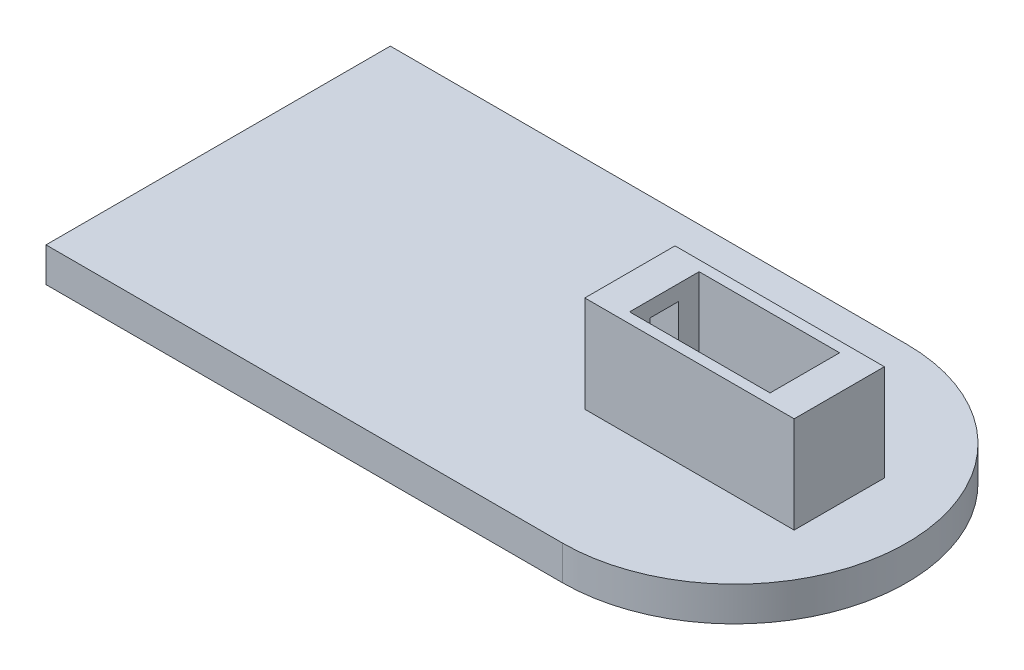
ISO-10303-21;
HEADER;
FILE_DESCRIPTION(('STEP AP214'),'2;1');
FILE_NAME('part.step','',(''),(''),'','','');
FILE_SCHEMA(('AUTOMOTIVE_DESIGN { 1 0 10303 214 1 1 1 1 }'));
ENDSEC;
DATA;
#1=APPLICATION_CONTEXT('core data for automotive mechanical design processes');
#2=APPLICATION_PROTOCOL_DEFINITION('international standard','automotive_design',2000,#1);
#3=PRODUCT_CONTEXT('',#1,'mechanical');
#4=PRODUCT('Part','Part','',(#3));
#5=PRODUCT_RELATED_PRODUCT_CATEGORY('part','',(#4));
#6=PRODUCT_DEFINITION_FORMATION('','',#4);
#7=PRODUCT_DEFINITION_CONTEXT('part definition',#1,'design');
#8=PRODUCT_DEFINITION('design','',#6,#7);
#9=PRODUCT_DEFINITION_SHAPE('','',#8);
#10=(LENGTH_UNIT() NAMED_UNIT(*) SI_UNIT(.MILLI.,.METRE.));
#11=(NAMED_UNIT(*) PLANE_ANGLE_UNIT() SI_UNIT($,.RADIAN.));
#12=(NAMED_UNIT(*) SI_UNIT($,.STERADIAN.) SOLID_ANGLE_UNIT());
#13=UNCERTAINTY_MEASURE_WITH_UNIT(LENGTH_MEASURE(1.E-05),#10,'distance_accuracy_value','');
#14=(GEOMETRIC_REPRESENTATION_CONTEXT(3) GLOBAL_UNCERTAINTY_ASSIGNED_CONTEXT((#13)) GLOBAL_UNIT_ASSIGNED_CONTEXT((#10,
#11,#12)) REPRESENTATION_CONTEXT('',''));
#15=CARTESIAN_POINT('',(0.,0.,0.));
#16=DIRECTION('',(0.,0.,1.));
#17=DIRECTION('',(1.,0.,0.));
#18=AXIS2_PLACEMENT_3D('',#15,#16,#17);
#19=CARTESIAN_POINT('',(74.9999993017601,10.,-4.65493227297387E-07));
#20=DIRECTION('',(0.,1.,0.));
#21=DIRECTION('',(0.,0.,1.));
#22=AXIS2_PLACEMENT_3D('',#19,#20,#21);
#23=PLANE('',#22);
#24=DIRECTION('',(0.,0.,1.));
#25=VECTOR('',#24,1.);
#26=CARTESIAN_POINT('',(-74.9999993017602,10.,-50.0000004654932));
#27=LINE('',#26,#25);
#28=CARTESIAN_POINT('',(-74.9999993017602,10.,-50.0000004654932));
#29=VERTEX_POINT('',#28);
#30=CARTESIAN_POINT('',(-74.9999993017602,10.,49.9999995345068));
#31=VERTEX_POINT('',#30);
#32=EDGE_CURVE('E270',#29,#31,#27,.T.);
#33=ORIENTED_EDGE('',*,*,#32,.T.);
#34=DIRECTION('',(1.,0.,0.));
#35=VECTOR('',#34,1.);
#36=CARTESIAN_POINT('',(-74.9999993017602,10.,49.9999995345068));
#37=LINE('',#36,#35);
#38=CARTESIAN_POINT('',(74.9999979052805,10.,49.9999995345068));
#39=VERTEX_POINT('',#38);
#40=EDGE_CURVE('E273',#31,#39,#37,.T.);
#41=ORIENTED_EDGE('',*,*,#40,.T.);
#42=CARTESIAN_POINT('',(74.9999993017601,10.,-4.65493227297387E-07));
#43=DIRECTION('',(0.,1.,0.));
#44=DIRECTION('',(0.,0.,1.));
#45=AXIS2_PLACEMENT_3D('',#42,#43,#44);
#46=CIRCLE('',#45,50.);
#47=CARTESIAN_POINT('',(75.0000006982398,10.,-50.0000004654932));
#48=VERTEX_POINT('',#47);
#49=EDGE_CURVE('E276',#39,#48,#46,.T.);
#50=ORIENTED_EDGE('',*,*,#49,.T.);
#51=DIRECTION('',(1.,0.,0.));
#52=VECTOR('',#51,1.);
#53=CARTESIAN_POINT('',(-74.9999993017602,10.,-50.0000004654932));
#54=LINE('',#53,#52);
#55=EDGE_CURVE('E278',#29,#48,#54,.T.);
#56=ORIENTED_EDGE('',*,*,#55,.F.);
#57=EDGE_LOOP('',(#33,#41,#50,#56));
#58=FACE_BOUND('',#57,.T.);
#59=DIRECTION('',(1.,0.,0.));
#60=VECTOR('',#59,1.);
#61=CARTESIAN_POINT('',(51.5999993017601,10.,13.0999995345068));
#62=LINE('',#61,#60);
#63=CARTESIAN_POINT('',(44.5999993017601,10.,13.0999995345068));
#64=VERTEX_POINT('',#63);
#65=CARTESIAN_POINT('',(105.39999930176,10.,13.0999995345068));
#66=VERTEX_POINT('',#65);
#67=EDGE_CURVE('E80',#64,#66,#62,.T.);
#68=ORIENTED_EDGE('',*,*,#67,.F.);
#69=DIRECTION('',(0.,0.,1.));
#70=VECTOR('',#69,1.);
#71=CARTESIAN_POINT('',(44.5999993017601,10.,0.));
#72=LINE('',#71,#70);
#73=CARTESIAN_POINT('',(44.5999993017601,10.,-13.1000004654932));
#74=VERTEX_POINT('',#73);
#75=EDGE_CURVE('E200',#74,#64,#72,.T.);
#76=ORIENTED_EDGE('',*,*,#75,.F.);
#77=DIRECTION('',(1.,0.,0.));
#78=VECTOR('',#77,1.);
#79=CARTESIAN_POINT('',(51.5999993017601,10.,-13.1000004654932));
#80=LINE('',#79,#78);
#81=CARTESIAN_POINT('',(105.39999930176,10.,-13.1000004654932));
#82=VERTEX_POINT('',#81);
#83=EDGE_CURVE('E88',#74,#82,#80,.T.);
#84=ORIENTED_EDGE('',*,*,#83,.T.);
#85=DIRECTION('',(0.,0.,-1.));
#86=VECTOR('',#85,1.);
#87=CARTESIAN_POINT('',(105.39999930176,10.,13.0999995345068));
#88=LINE('',#87,#86);
#89=EDGE_CURVE('E218',#66,#82,#88,.T.);
#90=ORIENTED_EDGE('',*,*,#89,.F.);
#91=EDGE_LOOP('',(#68,#76,#84,#90));
#92=FACE_BOUND('',#91,.T.);
#93=ADVANCED_FACE('F65',(#58,#92),#23,.T.);
#94=CARTESIAN_POINT('',(-74.9999993017602,10.,-50.0000004654932));
#95=DIRECTION('',(1.,0.,0.));
#96=DIRECTION('',(0.,0.,-1.));
#97=AXIS2_PLACEMENT_3D('',#94,#95,#96);
#98=PLANE('',#97);
#99=DIRECTION('',(0.,0.,1.));
#100=VECTOR('',#99,1.);
#101=CARTESIAN_POINT('',(-74.9999993017602,0.,-50.0000004654932));
#102=LINE('',#101,#100);
#103=CARTESIAN_POINT('',(-74.9999993017602,0.,-50.0000004654932));
#104=VERTEX_POINT('',#103);
#105=CARTESIAN_POINT('',(-74.9999993017602,0.,49.9999995345068));
#106=VERTEX_POINT('',#105);
#107=EDGE_CURVE('E267',#104,#106,#102,.T.);
#108=ORIENTED_EDGE('',*,*,#107,.T.);
#109=DIRECTION('',(0.,-1.,0.));
#110=VECTOR('',#109,1.);
#111=CARTESIAN_POINT('',(-74.9999993017602,10.,49.9999995345068));
#112=LINE('',#111,#110);
#113=EDGE_CURVE('E297',#31,#106,#112,.T.);
#114=ORIENTED_EDGE('',*,*,#113,.F.);
#115=ORIENTED_EDGE('',*,*,#32,.F.);
#116=DIRECTION('',(0.,-1.,0.));
#117=VECTOR('',#116,1.);
#118=CARTESIAN_POINT('',(-74.9999993017602,10.,-50.0000004654932));
#119=LINE('',#118,#117);
#120=EDGE_CURVE('E281',#29,#104,#119,.T.);
#121=ORIENTED_EDGE('',*,*,#120,.T.);
#122=EDGE_LOOP('',(#108,#114,#115,#121));
#123=FACE_BOUND('',#122,.T.);
#124=ADVANCED_FACE('F67',(#123),#98,.F.);
#125=CARTESIAN_POINT('',(-74.9999993017602,10.,49.9999995345068));
#126=DIRECTION('',(0.,0.,-1.));
#127=DIRECTION('',(-1.,0.,0.));
#128=AXIS2_PLACEMENT_3D('',#125,#126,#127);
#129=PLANE('',#128);
#130=DIRECTION('',(1.,0.,0.));
#131=VECTOR('',#130,1.);
#132=CARTESIAN_POINT('',(-74.9999993017602,0.,49.9999995345068));
#133=LINE('',#132,#131);
#134=CARTESIAN_POINT('',(74.9999979052805,0.,49.9999995345068));
#135=VERTEX_POINT('',#134);
#136=EDGE_CURVE('E284',#106,#135,#133,.T.);
#137=ORIENTED_EDGE('',*,*,#136,.T.);
#138=DIRECTION('',(0.,-1.,0.));
#139=VECTOR('',#138,1.);
#140=CARTESIAN_POINT('',(74.9999979052805,10.,49.9999995345068));
#141=LINE('',#140,#139);
#142=EDGE_CURVE('E294',#39,#135,#141,.T.);
#143=ORIENTED_EDGE('',*,*,#142,.F.);
#144=ORIENTED_EDGE('',*,*,#40,.F.);
#145=ORIENTED_EDGE('',*,*,#113,.T.);
#146=EDGE_LOOP('',(#137,#143,#144,#145));
#147=FACE_BOUND('',#146,.T.);
#148=ADVANCED_FACE('F343',(#147),#129,.F.);
#149=CARTESIAN_POINT('',(74.9999993017601,10.,-4.65493227297387E-07));
#150=DIRECTION('',(0.,-1.,0.));
#151=DIRECTION('',(0.,0.,-1.));
#152=AXIS2_PLACEMENT_3D('',#149,#150,#151);
#153=CYLINDRICAL_SURFACE('',#152,50.);
#154=CARTESIAN_POINT('',(74.9999993017601,0.,-4.65493227297387E-07));
#155=DIRECTION('',(0.,1.,0.));
#156=DIRECTION('',(0.,0.,1.));
#157=AXIS2_PLACEMENT_3D('',#154,#155,#156);
#158=CIRCLE('',#157,50.);
#159=CARTESIAN_POINT('',(75.0000006982398,0.,-50.0000004654932));
#160=VERTEX_POINT('',#159);
#161=EDGE_CURVE('E286',#135,#160,#158,.T.);
#162=ORIENTED_EDGE('',*,*,#161,.T.);
#163=DIRECTION('',(0.,-1.,0.));
#164=VECTOR('',#163,1.);
#165=CARTESIAN_POINT('',(75.0000006982398,10.,-50.0000004654932));
#166=LINE('',#165,#164);
#167=EDGE_CURVE('E292',#48,#160,#166,.T.);
#168=ORIENTED_EDGE('',*,*,#167,.F.);
#169=ORIENTED_EDGE('',*,*,#49,.F.);
#170=ORIENTED_EDGE('',*,*,#142,.T.);
#171=EDGE_LOOP('',(#162,#168,#169,#170));
#172=FACE_BOUND('',#171,.T.);
#173=ADVANCED_FACE('F511',(#172),#153,.T.);
#174=CARTESIAN_POINT('',(-74.9999993017602,10.,-50.0000004654932));
#175=DIRECTION('',(0.,0.,-1.));
#176=DIRECTION('',(-1.,0.,0.));
#177=AXIS2_PLACEMENT_3D('',#174,#175,#176);
#178=PLANE('',#177);
#179=DIRECTION('',(1.,0.,0.));
#180=VECTOR('',#179,1.);
#181=CARTESIAN_POINT('',(-74.9999993017602,0.,-50.0000004654932));
#182=LINE('',#181,#180);
#183=EDGE_CURVE('E274',#104,#160,#182,.T.);
#184=ORIENTED_EDGE('',*,*,#183,.F.);
#185=ORIENTED_EDGE('',*,*,#120,.F.);
#186=ORIENTED_EDGE('',*,*,#55,.T.);
#187=ORIENTED_EDGE('',*,*,#167,.T.);
#188=EDGE_LOOP('',(#184,#185,#186,#187));
#189=FACE_BOUND('',#188,.T.);
#190=ADVANCED_FACE('F377',(#189),#178,.T.);
#191=CARTESIAN_POINT('',(74.9999993017601,0.,-4.65493227297387E-07));
#192=DIRECTION('',(0.,1.,0.));
#193=DIRECTION('',(0.,0.,1.));
#194=AXIS2_PLACEMENT_3D('',#191,#192,#193);
#195=PLANE('',#194);
#196=ORIENTED_EDGE('',*,*,#107,.F.);
#197=ORIENTED_EDGE('',*,*,#183,.T.);
#198=ORIENTED_EDGE('',*,*,#161,.F.);
#199=ORIENTED_EDGE('',*,*,#136,.F.);
#200=EDGE_LOOP('',(#196,#197,#198,#199));
#201=FACE_BOUND('',#200,.T.);
#202=ADVANCED_FACE('F370',(#201),#195,.F.);
#203=CARTESIAN_POINT('',(0.,38.,0.));
#204=DIRECTION('',(0.,1.,0.));
#205=DIRECTION('',(0.,0.,1.));
#206=AXIS2_PLACEMENT_3D('',#203,#204,#205);
#207=PLANE('',#206);
#208=DIRECTION('',(1.,0.,0.));
#209=VECTOR('',#208,1.);
#210=CARTESIAN_POINT('',(51.5999993017601,38.,-13.1000004654932));
#211=LINE('',#210,#209);
#212=CARTESIAN_POINT('',(44.5999993017601,38.,-13.1000004654932));
#213=VERTEX_POINT('',#212);
#214=CARTESIAN_POINT('',(105.39999930176,38.,-13.1000004654932));
#215=VERTEX_POINT('',#214);
#216=EDGE_CURVE('E188',#213,#215,#211,.T.);
#217=ORIENTED_EDGE('',*,*,#216,.F.);
#218=DIRECTION('',(0.,0.,-1.));
#219=VECTOR('',#218,1.);
#220=CARTESIAN_POINT('',(44.5999993017601,38.,0.));
#221=LINE('',#220,#219);
#222=CARTESIAN_POINT('',(44.5999993017601,38.,13.0999995345068));
#223=VERTEX_POINT('',#222);
#224=EDGE_CURVE('E191',#223,#213,#221,.T.);
#225=ORIENTED_EDGE('',*,*,#224,.F.);
#226=DIRECTION('',(1.,0.,0.));
#227=VECTOR('',#226,1.);
#228=CARTESIAN_POINT('',(51.5999993017601,38.,13.0999995345068));
#229=LINE('',#228,#227);
#230=CARTESIAN_POINT('',(105.39999930176,38.,13.0999995345068));
#231=VERTEX_POINT('',#230);
#232=EDGE_CURVE('E178',#223,#231,#229,.T.);
#233=ORIENTED_EDGE('',*,*,#232,.T.);
#234=DIRECTION('',(0.,0.,1.));
#235=VECTOR('',#234,1.);
#236=CARTESIAN_POINT('',(105.39999930176,38.,13.0999995345068));
#237=LINE('',#236,#235);
#238=EDGE_CURVE('E224',#215,#231,#237,.T.);
#239=ORIENTED_EDGE('',*,*,#238,.F.);
#240=EDGE_LOOP('',(#217,#225,#233,#239));
#241=FACE_BOUND('',#240,.T.);
#242=DIRECTION('',(0.,0.,1.));
#243=VECTOR('',#242,1.);
#244=CARTESIAN_POINT('',(95.3999993017601,38.,-10.1000004654932));
#245=LINE('',#244,#243);
#246=CARTESIAN_POINT('',(95.3999993017601,38.,-10.1000004654932));
#247=VERTEX_POINT('',#246);
#248=CARTESIAN_POINT('',(95.3999993017601,38.,10.0999995345068));
#249=VERTEX_POINT('',#248);
#250=EDGE_CURVE('E237',#247,#249,#245,.T.);
#251=ORIENTED_EDGE('',*,*,#250,.T.);
#252=DIRECTION('',(1.,0.,0.));
#253=VECTOR('',#252,1.);
#254=CARTESIAN_POINT('',(54.5999993017602,38.,10.0999995345068));
#255=LINE('',#254,#253);
#256=CARTESIAN_POINT('',(54.5999993017602,38.,10.0999995345068));
#257=VERTEX_POINT('',#256);
#258=EDGE_CURVE('E235',#257,#249,#255,.T.);
#259=ORIENTED_EDGE('',*,*,#258,.F.);
#260=DIRECTION('',(0.,0.,1.));
#261=VECTOR('',#260,1.);
#262=CARTESIAN_POINT('',(54.5999993017602,38.,-10.1000004654932));
#263=LINE('',#262,#261);
#264=CARTESIAN_POINT('',(54.5999993017602,38.,-10.1000004654932));
#265=VERTEX_POINT('',#264);
#266=EDGE_CURVE('E244',#265,#257,#263,.T.);
#267=ORIENTED_EDGE('',*,*,#266,.F.);
#268=DIRECTION('',(1.,0.,0.));
#269=VECTOR('',#268,1.);
#270=CARTESIAN_POINT('',(54.5999993017602,38.,-10.1000004654932));
#271=LINE('',#270,#269);
#272=EDGE_CURVE('E241',#265,#247,#271,.T.);
#273=ORIENTED_EDGE('',*,*,#272,.T.);
#274=EDGE_LOOP('',(#251,#259,#267,#273));
#275=FACE_BOUND('',#274,.T.);
#276=ADVANCED_FACE('F192',(#241,#275),#207,.T.);
#277=CARTESIAN_POINT('',(51.5999993017601,38.,13.0999995345068));
#278=DIRECTION('',(0.,0.,-1.));
#279=DIRECTION('',(-1.,0.,0.));
#280=AXIS2_PLACEMENT_3D('',#277,#278,#279);
#281=PLANE('',#280);
#282=ORIENTED_EDGE('',*,*,#67,.T.);
#283=DIRECTION('',(0.,-1.,0.));
#284=VECTOR('',#283,1.);
#285=CARTESIAN_POINT('',(105.39999930176,38.,13.0999995345068));
#286=LINE('',#285,#284);
#287=EDGE_CURVE('E184',#231,#66,#286,.T.);
#288=ORIENTED_EDGE('',*,*,#287,.F.);
#289=ORIENTED_EDGE('',*,*,#232,.F.);
#290=DIRECTION('',(0.,1.,0.));
#291=VECTOR('',#290,1.);
#292=CARTESIAN_POINT('',(44.5999993017601,0.,13.0999995345068));
#293=LINE('',#292,#291);
#294=EDGE_CURVE('E182',#64,#223,#293,.T.);
#295=ORIENTED_EDGE('',*,*,#294,.F.);
#296=EDGE_LOOP('',(#282,#288,#289,#295));
#297=FACE_BOUND('',#296,.T.);
#298=ADVANCED_FACE('F180',(#297),#281,.F.);
#299=CARTESIAN_POINT('',(51.5999993017601,38.,-13.1000004654932));
#300=DIRECTION('',(0.,0.,-1.));
#301=DIRECTION('',(-1.,0.,0.));
#302=AXIS2_PLACEMENT_3D('',#299,#300,#301);
#303=PLANE('',#302);
#304=ORIENTED_EDGE('',*,*,#83,.F.);
#305=DIRECTION('',(0.,-1.,0.));
#306=VECTOR('',#305,1.);
#307=CARTESIAN_POINT('',(44.5999993017601,0.,-13.1000004654932));
#308=LINE('',#307,#306);
#309=EDGE_CURVE('E196',#213,#74,#308,.T.);
#310=ORIENTED_EDGE('',*,*,#309,.F.);
#311=ORIENTED_EDGE('',*,*,#216,.T.);
#312=DIRECTION('',(0.,1.,0.));
#313=VECTOR('',#312,1.);
#314=CARTESIAN_POINT('',(105.39999930176,38.,-13.1000004654932));
#315=LINE('',#314,#313);
#316=EDGE_CURVE('E221',#82,#215,#315,.T.);
#317=ORIENTED_EDGE('',*,*,#316,.F.);
#318=EDGE_LOOP('',(#304,#310,#311,#317));
#319=FACE_BOUND('',#318,.T.);
#320=ADVANCED_FACE('F375',(#319),#303,.T.);
#321=CARTESIAN_POINT('',(54.5999993017602,38.,10.0999995345068));
#322=DIRECTION('',(0.,0.,-1.));
#323=DIRECTION('',(-1.,0.,0.));
#324=AXIS2_PLACEMENT_3D('',#321,#322,#323);
#325=PLANE('',#324);
#326=DIRECTION('',(1.,0.,0.));
#327=VECTOR('',#326,1.);
#328=CARTESIAN_POINT('',(54.5999993017602,10.,10.0999995345068));
#329=LINE('',#328,#327);
#330=CARTESIAN_POINT('',(54.5999993017602,10.,10.0999995345068));
#331=VERTEX_POINT('',#330);
#332=CARTESIAN_POINT('',(95.3999993017601,10.,10.0999995345068));
#333=VERTEX_POINT('',#332);
#334=EDGE_CURVE('E229',#331,#333,#329,.T.);
#335=ORIENTED_EDGE('',*,*,#334,.F.);
#336=DIRECTION('',(0.,-1.,0.));
#337=VECTOR('',#336,1.);
#338=CARTESIAN_POINT('',(54.5999993017602,38.,10.0999995345068));
#339=LINE('',#338,#337);
#340=EDGE_CURVE('E246',#257,#331,#339,.T.);
#341=ORIENTED_EDGE('',*,*,#340,.F.);
#342=ORIENTED_EDGE('',*,*,#258,.T.);
#343=DIRECTION('',(0.,-1.,0.));
#344=VECTOR('',#343,1.);
#345=CARTESIAN_POINT('',(95.3999993017601,38.,10.0999995345068));
#346=LINE('',#345,#344);
#347=EDGE_CURVE('E263',#249,#333,#346,.T.);
#348=ORIENTED_EDGE('',*,*,#347,.T.);
#349=EDGE_LOOP('',(#335,#341,#342,#348));
#350=FACE_BOUND('',#349,.T.);
#351=ADVANCED_FACE('F362',(#350),#325,.T.);
#352=CARTESIAN_POINT('',(95.3999993017601,38.,-10.1000004654932));
#353=DIRECTION('',(1.,0.,0.));
#354=DIRECTION('',(0.,0.,-1.));
#355=AXIS2_PLACEMENT_3D('',#352,#353,#354);
#356=PLANE('',#355);
#357=DIRECTION('',(0.,0.,1.));
#358=VECTOR('',#357,1.);
#359=CARTESIAN_POINT('',(95.3999993017601,10.,-10.1000004654932));
#360=LINE('',#359,#358);
#361=CARTESIAN_POINT('',(95.3999993017601,10.,-10.1000004654932));
#362=VERTEX_POINT('',#361);
#363=EDGE_CURVE('E248',#362,#333,#360,.T.);
#364=ORIENTED_EDGE('',*,*,#363,.T.);
#365=ORIENTED_EDGE('',*,*,#347,.F.);
#366=ORIENTED_EDGE('',*,*,#250,.F.);
#367=DIRECTION('',(0.,-1.,0.));
#368=VECTOR('',#367,1.);
#369=CARTESIAN_POINT('',(95.3999993017601,38.,-10.1000004654932));
#370=LINE('',#369,#368);
#371=EDGE_CURVE('E260',#247,#362,#370,.T.);
#372=ORIENTED_EDGE('',*,*,#371,.T.);
#373=EDGE_LOOP('',(#364,#365,#366,#372));
#374=FACE_BOUND('',#373,.T.);
#375=ADVANCED_FACE('F366',(#374),#356,.F.);
#376=CARTESIAN_POINT('',(54.5999993017602,38.,-10.1000004654932));
#377=DIRECTION('',(0.,0.,-1.));
#378=DIRECTION('',(-1.,0.,0.));
#379=AXIS2_PLACEMENT_3D('',#376,#377,#378);
#380=PLANE('',#379);
#381=DIRECTION('',(1.,0.,0.));
#382=VECTOR('',#381,1.);
#383=CARTESIAN_POINT('',(54.5999993017602,10.,-10.1000004654932));
#384=LINE('',#383,#382);
#385=CARTESIAN_POINT('',(54.5999993017602,10.,-10.1000004654932));
#386=VERTEX_POINT('',#385);
#387=EDGE_CURVE('E251',#386,#362,#384,.T.);
#388=ORIENTED_EDGE('',*,*,#387,.T.);
#389=ORIENTED_EDGE('',*,*,#371,.F.);
#390=ORIENTED_EDGE('',*,*,#272,.F.);
#391=DIRECTION('',(0.,-1.,0.));
#392=VECTOR('',#391,1.);
#393=CARTESIAN_POINT('',(54.5999993017602,38.,-10.1000004654932));
#394=LINE('',#393,#392);
#395=EDGE_CURVE('E257',#265,#386,#394,.T.);
#396=ORIENTED_EDGE('',*,*,#395,.T.);
#397=EDGE_LOOP('',(#388,#389,#390,#396));
#398=FACE_BOUND('',#397,.T.);
#399=ADVANCED_FACE('F355',(#398),#380,.F.);
#400=CARTESIAN_POINT('',(54.5999993017602,38.,-10.1000004654932));
#401=DIRECTION('',(1.,0.,0.));
#402=DIRECTION('',(0.,0.,-1.));
#403=AXIS2_PLACEMENT_3D('',#400,#401,#402);
#404=PLANE('',#403);
#405=DIRECTION('',(0.,-1.,0.));
#406=VECTOR('',#405,1.);
#407=CARTESIAN_POINT('',(54.5999993017602,38.,4.17499953450677));
#408=LINE('',#407,#406);
#409=CARTESIAN_POINT('',(54.5999993017602,33.5,4.17499953450677));
#410=VERTEX_POINT('',#409);
#411=CARTESIAN_POINT('',(54.5999993017602,13.5,4.17499953450677));
#412=VERTEX_POINT('',#411);
#413=EDGE_CURVE('E12',#410,#412,#408,.T.);
#414=ORIENTED_EDGE('',*,*,#413,.F.);
#415=DIRECTION('',(0.,0.,1.));
#416=VECTOR('',#415,1.);
#417=CARTESIAN_POINT('',(54.5999993017602,33.5,-10.1000004654932));
#418=LINE('',#417,#416);
#419=CARTESIAN_POINT('',(54.5999993017602,33.5,-4.17500046549323));
#420=VERTEX_POINT('',#419);
#421=EDGE_CURVE('E300',#420,#410,#418,.T.);
#422=ORIENTED_EDGE('',*,*,#421,.F.);
#423=DIRECTION('',(0.,1.,0.));
#424=VECTOR('',#423,1.);
#425=CARTESIAN_POINT('',(54.5999993017602,38.,-4.17500046549323));
#426=LINE('',#425,#424);
#427=CARTESIAN_POINT('',(54.5999993017602,13.5,-4.17500046549322));
#428=VERTEX_POINT('',#427);
#429=EDGE_CURVE('E302',#428,#420,#426,.T.);
#430=ORIENTED_EDGE('',*,*,#429,.F.);
#431=DIRECTION('',(0.,0.,-1.));
#432=VECTOR('',#431,1.);
#433=CARTESIAN_POINT('',(54.5999993017602,13.5,-10.1000004654932));
#434=LINE('',#433,#432);
#435=EDGE_CURVE('E73',#412,#428,#434,.T.);
#436=ORIENTED_EDGE('',*,*,#435,.F.);
#437=EDGE_LOOP('',(#414,#422,#430,#436));
#438=FACE_BOUND('',#437,.T.);
#439=DIRECTION('',(0.,0.,1.));
#440=VECTOR('',#439,1.);
#441=CARTESIAN_POINT('',(54.5999993017602,10.,-10.1000004654932));
#442=LINE('',#441,#440);
#443=EDGE_CURVE('E238',#386,#331,#442,.T.);
#444=ORIENTED_EDGE('',*,*,#443,.F.);
#445=ORIENTED_EDGE('',*,*,#395,.F.);
#446=ORIENTED_EDGE('',*,*,#266,.T.);
#447=ORIENTED_EDGE('',*,*,#340,.T.);
#448=EDGE_LOOP('',(#444,#445,#446,#447));
#449=FACE_BOUND('',#448,.T.);
#450=ADVANCED_FACE('F317',(#438,#449),#404,.T.);
#451=ORIENTED_EDGE('',*,*,#334,.T.);
#452=ORIENTED_EDGE('',*,*,#363,.F.);
#453=ORIENTED_EDGE('',*,*,#387,.F.);
#454=ORIENTED_EDGE('',*,*,#443,.T.);
#455=EDGE_LOOP('',(#451,#452,#453,#454));
#456=FACE_BOUND('',#455,.T.);
#457=ADVANCED_FACE('F338',(#456),#23,.T.);
#458=CARTESIAN_POINT('',(79.5999993017601,33.5,4.17499953450677));
#459=DIRECTION('',(0.,0.,1.));
#460=DIRECTION('',(1.,0.,0.));
#461=AXIS2_PLACEMENT_3D('',#458,#459,#460);
#462=PLANE('',#461);
#463=ORIENTED_EDGE('',*,*,#413,.T.);
#464=DIRECTION('',(-1.,0.,0.));
#465=VECTOR('',#464,1.);
#466=CARTESIAN_POINT('',(79.5999993017601,13.5,4.17499953450677));
#467=LINE('',#466,#465);
#468=CARTESIAN_POINT('',(44.5999993017601,13.5,4.17499953450677));
#469=VERTEX_POINT('',#468);
#470=EDGE_CURVE('E227',#412,#469,#467,.T.);
#471=ORIENTED_EDGE('',*,*,#470,.T.);
#472=DIRECTION('',(0.,1.,0.));
#473=VECTOR('',#472,1.);
#474=CARTESIAN_POINT('',(44.5999993017601,0.,4.17499953450677));
#475=LINE('',#474,#473);
#476=CARTESIAN_POINT('',(44.5999993017601,33.5,4.17499953450677));
#477=VERTEX_POINT('',#476);
#478=EDGE_CURVE('E211',#469,#477,#475,.T.);
#479=ORIENTED_EDGE('',*,*,#478,.T.);
#480=DIRECTION('',(-1.,0.,0.));
#481=VECTOR('',#480,1.);
#482=CARTESIAN_POINT('',(79.5999993017601,33.5,4.17499953450677));
#483=LINE('',#482,#481);
#484=EDGE_CURVE('E226',#410,#477,#483,.T.);
#485=ORIENTED_EDGE('',*,*,#484,.F.);
#486=EDGE_LOOP('',(#463,#471,#479,#485));
#487=FACE_BOUND('',#486,.T.);
#488=ADVANCED_FACE('F324',(#487),#462,.F.);
#489=CARTESIAN_POINT('',(79.5999993017601,13.5,-4.17500046549322));
#490=DIRECTION('',(0.,-1.,0.));
#491=DIRECTION('',(0.,0.,-1.));
#492=AXIS2_PLACEMENT_3D('',#489,#490,#491);
#493=PLANE('',#492);
#494=ORIENTED_EDGE('',*,*,#435,.T.);
#495=DIRECTION('',(-1.,0.,0.));
#496=VECTOR('',#495,1.);
#497=CARTESIAN_POINT('',(79.5999993017601,13.5,-4.17500046549322));
#498=LINE('',#497,#496);
#499=CARTESIAN_POINT('',(44.5999993017601,13.5,-4.17500046549322));
#500=VERTEX_POINT('',#499);
#501=EDGE_CURVE('E230',#428,#500,#498,.T.);
#502=ORIENTED_EDGE('',*,*,#501,.T.);
#503=DIRECTION('',(0.,0.,-1.));
#504=VECTOR('',#503,1.);
#505=CARTESIAN_POINT('',(44.5999993017601,13.5,0.));
#506=LINE('',#505,#504);
#507=EDGE_CURVE('E214',#469,#500,#506,.T.);
#508=ORIENTED_EDGE('',*,*,#507,.F.);
#509=ORIENTED_EDGE('',*,*,#470,.F.);
#510=EDGE_LOOP('',(#494,#502,#508,#509));
#511=FACE_BOUND('',#510,.T.);
#512=ADVANCED_FACE('F308',(#511),#493,.F.);
#513=CARTESIAN_POINT('',(79.5999993017601,33.5,-4.17500046549323));
#514=DIRECTION('',(0.,0.,-1.));
#515=DIRECTION('',(0.,1.,0.));
#516=AXIS2_PLACEMENT_3D('',#513,#514,#515);
#517=PLANE('',#516);
#518=ORIENTED_EDGE('',*,*,#429,.T.);
#519=DIRECTION('',(-1.,0.,0.));
#520=VECTOR('',#519,1.);
#521=CARTESIAN_POINT('',(79.5999993017601,33.5,-4.17500046549323));
#522=LINE('',#521,#520);
#523=CARTESIAN_POINT('',(44.5999993017601,33.5,-4.17500046549323));
#524=VERTEX_POINT('',#523);
#525=EDGE_CURVE('E232',#420,#524,#522,.T.);
#526=ORIENTED_EDGE('',*,*,#525,.T.);
#527=DIRECTION('',(0.,1.,0.));
#528=VECTOR('',#527,1.);
#529=CARTESIAN_POINT('',(44.5999993017601,0.,-4.17500046549322));
#530=LINE('',#529,#528);
#531=EDGE_CURVE('E205',#500,#524,#530,.T.);
#532=ORIENTED_EDGE('',*,*,#531,.F.);
#533=ORIENTED_EDGE('',*,*,#501,.F.);
#534=EDGE_LOOP('',(#518,#526,#532,#533));
#535=FACE_BOUND('',#534,.T.);
#536=ADVANCED_FACE('F315',(#535),#517,.F.);
#537=CARTESIAN_POINT('',(79.5999993017601,33.5,-4.17500046549323));
#538=DIRECTION('',(0.,1.,0.));
#539=DIRECTION('',(0.,0.,1.));
#540=AXIS2_PLACEMENT_3D('',#537,#538,#539);
#541=PLANE('',#540);
#542=ORIENTED_EDGE('',*,*,#421,.T.);
#543=ORIENTED_EDGE('',*,*,#484,.T.);
#544=DIRECTION('',(0.,0.,1.));
#545=VECTOR('',#544,1.);
#546=CARTESIAN_POINT('',(44.5999993017601,33.5,0.));
#547=LINE('',#546,#545);
#548=EDGE_CURVE('E208',#524,#477,#547,.T.);
#549=ORIENTED_EDGE('',*,*,#548,.F.);
#550=ORIENTED_EDGE('',*,*,#525,.F.);
#551=EDGE_LOOP('',(#542,#543,#549,#550));
#552=FACE_BOUND('',#551,.T.);
#553=ADVANCED_FACE('F321',(#552),#541,.F.);
#554=CARTESIAN_POINT('',(105.39999930176,0.,0.));
#555=DIRECTION('',(1.,0.,0.));
#556=DIRECTION('',(0.,0.,-1.));
#557=AXIS2_PLACEMENT_3D('',#554,#555,#556);
#558=PLANE('',#557);
#559=ORIENTED_EDGE('',*,*,#287,.T.);
#560=ORIENTED_EDGE('',*,*,#89,.T.);
#561=ORIENTED_EDGE('',*,*,#316,.T.);
#562=ORIENTED_EDGE('',*,*,#238,.T.);
#563=EDGE_LOOP('',(#559,#560,#561,#562));
#564=FACE_BOUND('',#563,.T.);
#565=ADVANCED_FACE('F327',(#564),#558,.T.);
#566=CARTESIAN_POINT('',(44.5999993017601,0.,0.));
#567=DIRECTION('',(-1.,0.,0.));
#568=DIRECTION('',(0.,0.,1.));
#569=AXIS2_PLACEMENT_3D('',#566,#567,#568);
#570=PLANE('',#569);
#571=ORIENTED_EDGE('',*,*,#294,.T.);
#572=ORIENTED_EDGE('',*,*,#224,.T.);
#573=ORIENTED_EDGE('',*,*,#309,.T.);
#574=ORIENTED_EDGE('',*,*,#75,.T.);
#575=EDGE_LOOP('',(#571,#572,#573,#574));
#576=FACE_BOUND('',#575,.T.);
#577=ORIENTED_EDGE('',*,*,#531,.T.);
#578=ORIENTED_EDGE('',*,*,#548,.T.);
#579=ORIENTED_EDGE('',*,*,#478,.F.);
#580=ORIENTED_EDGE('',*,*,#507,.T.);
#581=EDGE_LOOP('',(#577,#578,#579,#580));
#582=FACE_BOUND('',#581,.T.);
#583=ADVANCED_FACE('F198',(#576,#582),#570,.T.);
#584=CLOSED_SHELL('',(#93,#124,#148,#173,#190,#202,#276,#298,#320,#351,#375,#399,#450,#457,#488,
#512,#536,#553,#565,#583));
#585=MANIFOLD_SOLID_BREP('B2',#584);
#586=ADVANCED_BREP_SHAPE_REPRESENTATION('',(#18,#585),#14);
#587=SHAPE_DEFINITION_REPRESENTATION(#9,#586);
ENDSEC;
END-ISO-10303-21;
